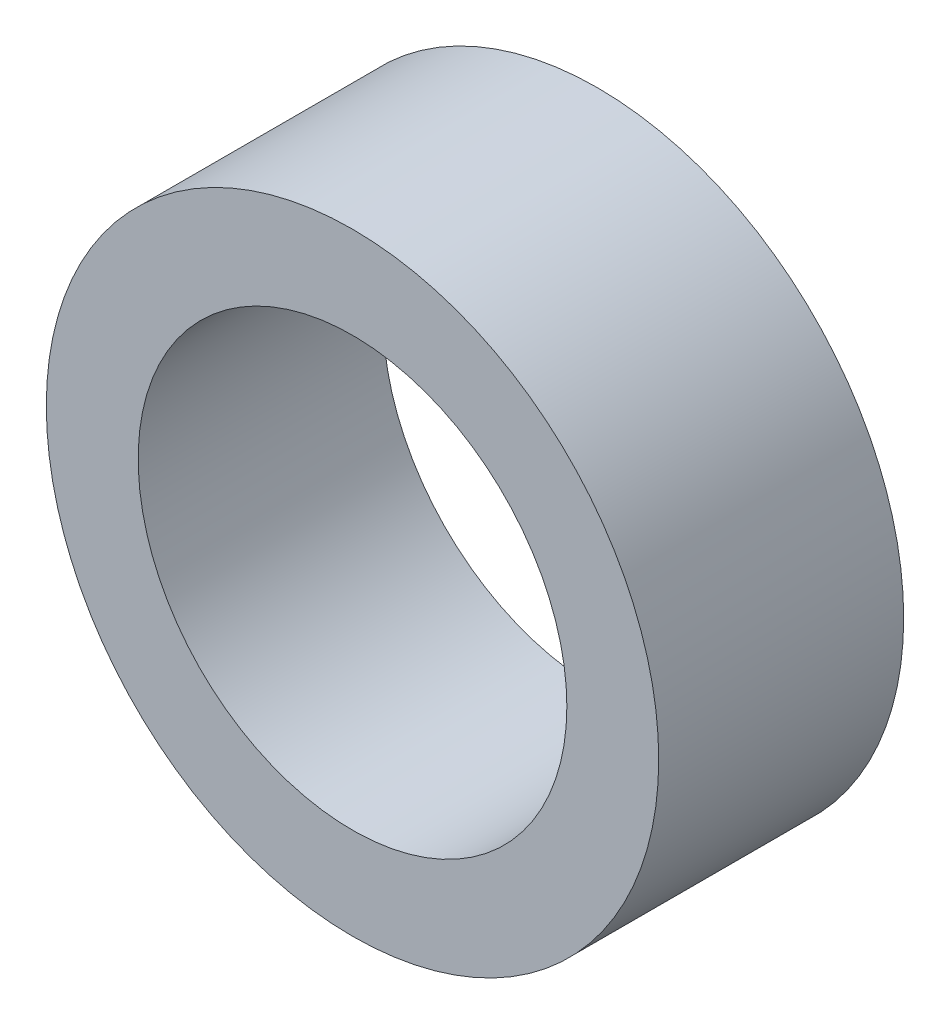
ISO-10303-21;
HEADER;
FILE_DESCRIPTION(('STEP AP214'),'2;1');
FILE_NAME('part.step','',(''),(''),'','','');
FILE_SCHEMA(('AUTOMOTIVE_DESIGN { 1 0 10303 214 1 1 1 1 }'));
ENDSEC;
DATA;
#1=APPLICATION_CONTEXT('core data for automotive mechanical design processes');
#2=APPLICATION_PROTOCOL_DEFINITION('international standard','automotive_design',2000,#1);
#3=PRODUCT_CONTEXT('',#1,'mechanical');
#4=PRODUCT('Part','Part','',(#3));
#5=PRODUCT_RELATED_PRODUCT_CATEGORY('part','',(#4));
#6=PRODUCT_DEFINITION_FORMATION('','',#4);
#7=PRODUCT_DEFINITION_CONTEXT('part definition',#1,'design');
#8=PRODUCT_DEFINITION('design','',#6,#7);
#9=PRODUCT_DEFINITION_SHAPE('','',#8);
#10=(LENGTH_UNIT() NAMED_UNIT(*) SI_UNIT(.MILLI.,.METRE.));
#11=(NAMED_UNIT(*) PLANE_ANGLE_UNIT() SI_UNIT($,.RADIAN.));
#12=(NAMED_UNIT(*) SI_UNIT($,.STERADIAN.) SOLID_ANGLE_UNIT());
#13=UNCERTAINTY_MEASURE_WITH_UNIT(LENGTH_MEASURE(1.E-05),#10,'distance_accuracy_value','');
#14=(GEOMETRIC_REPRESENTATION_CONTEXT(3) GLOBAL_UNCERTAINTY_ASSIGNED_CONTEXT((#13)) GLOBAL_UNIT_ASSIGNED_CONTEXT((#10,
#11,#12)) REPRESENTATION_CONTEXT('',''));
#15=CARTESIAN_POINT('',(0.,0.,0.));
#16=DIRECTION('',(0.,0.,1.));
#17=DIRECTION('',(1.,0.,0.));
#18=AXIS2_PLACEMENT_3D('',#15,#16,#17);
#19=CARTESIAN_POINT('',(0.,0.,20.));
#20=DIRECTION('',(0.,0.,1.));
#21=DIRECTION('',(1.,0.,0.));
#22=AXIS2_PLACEMENT_3D('',#19,#20,#21);
#23=PLANE('',#22);
#24=CARTESIAN_POINT('',(0.,0.,20.));
#25=DIRECTION('',(0.,0.,1.));
#26=DIRECTION('',(1.,0.,0.));
#27=AXIS2_PLACEMENT_3D('',#24,#25,#26);
#28=CIRCLE('',#27,50.);
#29=CARTESIAN_POINT('',(50.,0.,20.));
#30=VERTEX_POINT('',#29);
#31=EDGE_CURVE('E10',#30,#30,#28,.T.);
#32=ORIENTED_EDGE('',*,*,#31,.T.);
#33=EDGE_LOOP('',(#32));
#34=FACE_BOUND('',#33,.T.);
#35=CARTESIAN_POINT('',(0.,0.,20.));
#36=DIRECTION('',(0.,0.,1.));
#37=DIRECTION('',(1.,0.,0.));
#38=AXIS2_PLACEMENT_3D('',#35,#36,#37);
#39=CIRCLE('',#38,35.);
#40=CARTESIAN_POINT('',(35.,0.,20.));
#41=VERTEX_POINT('',#40);
#42=EDGE_CURVE('E45',#41,#41,#39,.T.);
#43=ORIENTED_EDGE('',*,*,#42,.F.);
#44=EDGE_LOOP('',(#43));
#45=FACE_BOUND('',#44,.T.);
#46=ADVANCED_FACE('F37',(#34,#45),#23,.T.);
#47=CARTESIAN_POINT('',(0.,0.,20.));
#48=DIRECTION('',(0.,0.,-1.));
#49=DIRECTION('',(-1.,0.,0.));
#50=AXIS2_PLACEMENT_3D('',#47,#48,#49);
#51=CYLINDRICAL_SURFACE('',#50,50.);
#52=ORIENTED_EDGE('',*,*,#31,.F.);
#53=EDGE_LOOP('',(#52));
#54=FACE_BOUND('',#53,.T.);
#55=CARTESIAN_POINT('',(0.,0.,-20.));
#56=DIRECTION('',(0.,0.,1.));
#57=DIRECTION('',(1.,0.,0.));
#58=AXIS2_PLACEMENT_3D('',#55,#56,#57);
#59=CIRCLE('',#58,50.);
#60=CARTESIAN_POINT('',(50.,0.,-20.));
#61=VERTEX_POINT('',#60);
#62=EDGE_CURVE('E50',#61,#61,#59,.T.);
#63=ORIENTED_EDGE('',*,*,#62,.T.);
#64=EDGE_LOOP('',(#63));
#65=FACE_BOUND('',#64,.T.);
#66=ADVANCED_FACE('F39',(#54,#65),#51,.T.);
#67=CARTESIAN_POINT('',(0.,0.,20.));
#68=DIRECTION('',(0.,0.,-1.));
#69=DIRECTION('',(-1.,0.,0.));
#70=AXIS2_PLACEMENT_3D('',#67,#68,#69);
#71=CYLINDRICAL_SURFACE('',#70,35.);
#72=ORIENTED_EDGE('',*,*,#42,.T.);
#73=EDGE_LOOP('',(#72));
#74=FACE_BOUND('',#73,.T.);
#75=CARTESIAN_POINT('',(0.,0.,-20.));
#76=DIRECTION('',(0.,0.,1.));
#77=DIRECTION('',(1.,0.,0.));
#78=AXIS2_PLACEMENT_3D('',#75,#76,#77);
#79=CIRCLE('',#78,35.);
#80=CARTESIAN_POINT('',(35.,0.,-20.));
#81=VERTEX_POINT('',#80);
#82=EDGE_CURVE('E55',#81,#81,#79,.T.);
#83=ORIENTED_EDGE('',*,*,#82,.F.);
#84=EDGE_LOOP('',(#83));
#85=FACE_BOUND('',#84,.T.);
#86=ADVANCED_FACE('F65',(#74,#85),#71,.F.);
#87=CARTESIAN_POINT('',(0.,0.,-20.));
#88=DIRECTION('',(0.,0.,-1.));
#89=DIRECTION('',(1.,0.,0.));
#90=AXIS2_PLACEMENT_3D('',#87,#88,#89);
#91=PLANE('',#90);
#92=ORIENTED_EDGE('',*,*,#82,.T.);
#93=EDGE_LOOP('',(#92));
#94=FACE_BOUND('',#93,.T.);
#95=ORIENTED_EDGE('',*,*,#62,.F.);
#96=EDGE_LOOP('',(#95));
#97=FACE_BOUND('',#96,.T.);
#98=ADVANCED_FACE('F62',(#94,#97),#91,.T.);
#99=CLOSED_SHELL('',(#46,#66,#86,#98));
#100=MANIFOLD_SOLID_BREP('B2',#99);
#101=ADVANCED_BREP_SHAPE_REPRESENTATION('',(#18,#100),#14);
#102=SHAPE_DEFINITION_REPRESENTATION(#9,#101);
ENDSEC;
END-ISO-10303-21;
